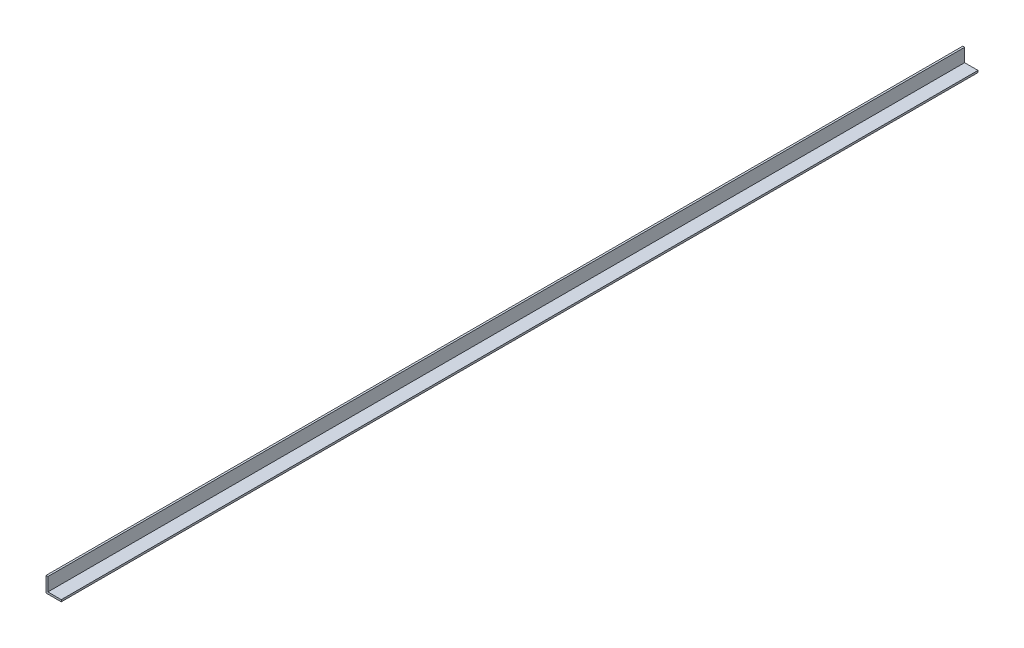
ISO-10303-21;
HEADER;
FILE_DESCRIPTION(('STEP AP214'),'2;1');
FILE_NAME('part.step','',(''),(''),'','','');
FILE_SCHEMA(('AUTOMOTIVE_DESIGN { 1 0 10303 214 1 1 1 1 }'));
ENDSEC;
DATA;
#1=APPLICATION_CONTEXT('core data for automotive mechanical design processes');
#2=APPLICATION_PROTOCOL_DEFINITION('international standard','automotive_design',2000,#1);
#3=PRODUCT_CONTEXT('',#1,'mechanical');
#4=PRODUCT('Part','Part','',(#3));
#5=PRODUCT_RELATED_PRODUCT_CATEGORY('part','',(#4));
#6=PRODUCT_DEFINITION_FORMATION('','',#4);
#7=PRODUCT_DEFINITION_CONTEXT('part definition',#1,'design');
#8=PRODUCT_DEFINITION('design','',#6,#7);
#9=PRODUCT_DEFINITION_SHAPE('','',#8);
#10=(LENGTH_UNIT() NAMED_UNIT(*) SI_UNIT(.MILLI.,.METRE.));
#11=(NAMED_UNIT(*) PLANE_ANGLE_UNIT() SI_UNIT($,.RADIAN.));
#12=(NAMED_UNIT(*) SI_UNIT($,.STERADIAN.) SOLID_ANGLE_UNIT());
#13=UNCERTAINTY_MEASURE_WITH_UNIT(LENGTH_MEASURE(1.E-05),#10,'distance_accuracy_value','');
#14=(GEOMETRIC_REPRESENTATION_CONTEXT(3) GLOBAL_UNCERTAINTY_ASSIGNED_CONTEXT((#13)) GLOBAL_UNIT_ASSIGNED_CONTEXT((#10,
#11,#12)) REPRESENTATION_CONTEXT('',''));
#15=CARTESIAN_POINT('',(0.,0.,0.));
#16=DIRECTION('',(0.,0.,1.));
#17=DIRECTION('',(1.,0.,0.));
#18=AXIS2_PLACEMENT_3D('',#15,#16,#17);
#19=CARTESIAN_POINT('',(12.7,101.6,-6100.));
#20=DIRECTION('',(0.,1.,0.));
#21=DIRECTION('',(0.,0.,1.));
#22=AXIS2_PLACEMENT_3D('',#19,#20,#21);
#23=PLANE('',#22);
#24=DIRECTION('',(-1.,0.,0.));
#25=VECTOR('',#24,1.);
#26=CARTESIAN_POINT('',(12.7,101.6,0.));
#27=LINE('',#26,#25);
#28=CARTESIAN_POINT('',(12.7,101.6,0.));
#29=VERTEX_POINT('',#28);
#30=CARTESIAN_POINT('',(0.,101.6,0.));
#31=VERTEX_POINT('',#30);
#32=EDGE_CURVE('E118',#29,#31,#27,.T.);
#33=ORIENTED_EDGE('',*,*,#32,.F.);
#34=DIRECTION('',(0.,0.,1.));
#35=VECTOR('',#34,1.);
#36=CARTESIAN_POINT('',(12.7,101.6,-6100.));
#37=LINE('',#36,#35);
#38=CARTESIAN_POINT('',(12.7,101.6,-6100.));
#39=VERTEX_POINT('',#38);
#40=EDGE_CURVE('E11',#39,#29,#37,.T.);
#41=ORIENTED_EDGE('',*,*,#40,.F.);
#42=DIRECTION('',(-1.,0.,0.));
#43=VECTOR('',#42,1.);
#44=CARTESIAN_POINT('',(12.7,101.6,-6100.));
#45=LINE('',#44,#43);
#46=CARTESIAN_POINT('',(0.,101.6,-6100.));
#47=VERTEX_POINT('',#46);
#48=EDGE_CURVE('E132',#39,#47,#45,.T.);
#49=ORIENTED_EDGE('',*,*,#48,.T.);
#50=DIRECTION('',(0.,0.,1.));
#51=VECTOR('',#50,1.);
#52=CARTESIAN_POINT('',(0.,101.6,-6100.));
#53=LINE('',#52,#51);
#54=EDGE_CURVE('E36',#47,#31,#53,.T.);
#55=ORIENTED_EDGE('',*,*,#54,.T.);
#56=EDGE_LOOP('',(#33,#41,#49,#55));
#57=FACE_BOUND('',#56,.T.);
#58=ADVANCED_FACE('F33',(#57),#23,.T.);
#59=CARTESIAN_POINT('',(12.7,12.7,-6100.));
#60=DIRECTION('',(1.,0.,0.));
#61=DIRECTION('',(0.,1.,0.));
#62=AXIS2_PLACEMENT_3D('',#59,#60,#61);
#63=PLANE('',#62);
#64=DIRECTION('',(0.,1.,0.));
#65=VECTOR('',#64,1.);
#66=CARTESIAN_POINT('',(12.7,12.7,0.));
#67=LINE('',#66,#65);
#68=CARTESIAN_POINT('',(12.7,12.7,0.));
#69=VERTEX_POINT('',#68);
#70=EDGE_CURVE('E130',#69,#29,#67,.T.);
#71=ORIENTED_EDGE('',*,*,#70,.F.);
#72=DIRECTION('',(0.,0.,1.));
#73=VECTOR('',#72,1.);
#74=CARTESIAN_POINT('',(12.7,12.7,-6100.));
#75=LINE('',#74,#73);
#76=CARTESIAN_POINT('',(12.7,12.7,-6100.));
#77=VERTEX_POINT('',#76);
#78=EDGE_CURVE('E42',#77,#69,#75,.T.);
#79=ORIENTED_EDGE('',*,*,#78,.F.);
#80=DIRECTION('',(0.,1.,0.));
#81=VECTOR('',#80,1.);
#82=CARTESIAN_POINT('',(12.7,12.7,-6100.));
#83=LINE('',#82,#81);
#84=EDGE_CURVE('E108',#77,#39,#83,.T.);
#85=ORIENTED_EDGE('',*,*,#84,.T.);
#86=ORIENTED_EDGE('',*,*,#40,.T.);
#87=EDGE_LOOP('',(#71,#79,#85,#86));
#88=FACE_BOUND('',#87,.T.);
#89=ADVANCED_FACE('F140',(#88),#63,.T.);
#90=CARTESIAN_POINT('',(101.6,12.7,-6100.));
#91=DIRECTION('',(0.,1.,0.));
#92=DIRECTION('',(-1.,0.,0.));
#93=AXIS2_PLACEMENT_3D('',#90,#91,#92);
#94=PLANE('',#93);
#95=DIRECTION('',(-1.,0.,0.));
#96=VECTOR('',#95,1.);
#97=CARTESIAN_POINT('',(101.6,12.7,0.));
#98=LINE('',#97,#96);
#99=CARTESIAN_POINT('',(101.6,12.7,0.));
#100=VERTEX_POINT('',#99);
#101=EDGE_CURVE('E95',#100,#69,#98,.T.);
#102=ORIENTED_EDGE('',*,*,#101,.F.);
#103=DIRECTION('',(0.,0.,1.));
#104=VECTOR('',#103,1.);
#105=CARTESIAN_POINT('',(101.6,12.7,-6100.));
#106=LINE('',#105,#104);
#107=CARTESIAN_POINT('',(101.6,12.7,-6100.));
#108=VERTEX_POINT('',#107);
#109=EDGE_CURVE('E90',#108,#100,#106,.T.);
#110=ORIENTED_EDGE('',*,*,#109,.F.);
#111=DIRECTION('',(-1.,0.,0.));
#112=VECTOR('',#111,1.);
#113=CARTESIAN_POINT('',(101.6,12.7,-6100.));
#114=LINE('',#113,#112);
#115=EDGE_CURVE('E93',#108,#77,#114,.T.);
#116=ORIENTED_EDGE('',*,*,#115,.T.);
#117=ORIENTED_EDGE('',*,*,#78,.T.);
#118=EDGE_LOOP('',(#102,#110,#116,#117));
#119=FACE_BOUND('',#118,.T.);
#120=ADVANCED_FACE('F92',(#119),#94,.T.);
#121=CARTESIAN_POINT('',(101.6,0.,-6100.));
#122=DIRECTION('',(1.,0.,0.));
#123=DIRECTION('',(0.,0.,-1.));
#124=AXIS2_PLACEMENT_3D('',#121,#122,#123);
#125=PLANE('',#124);
#126=DIRECTION('',(0.,1.,0.));
#127=VECTOR('',#126,1.);
#128=CARTESIAN_POINT('',(101.6,0.,0.));
#129=LINE('',#128,#127);
#130=CARTESIAN_POINT('',(101.6,0.,0.));
#131=VERTEX_POINT('',#130);
#132=EDGE_CURVE('E127',#131,#100,#129,.T.);
#133=ORIENTED_EDGE('',*,*,#132,.F.);
#134=DIRECTION('',(0.,0.,1.));
#135=VECTOR('',#134,1.);
#136=CARTESIAN_POINT('',(101.6,0.,-6100.));
#137=LINE('',#136,#135);
#138=CARTESIAN_POINT('',(101.6,0.,-6100.));
#139=VERTEX_POINT('',#138);
#140=EDGE_CURVE('E100',#139,#131,#137,.T.);
#141=ORIENTED_EDGE('',*,*,#140,.F.);
#142=DIRECTION('',(0.,1.,0.));
#143=VECTOR('',#142,1.);
#144=CARTESIAN_POINT('',(101.6,0.,-6100.));
#145=LINE('',#144,#143);
#146=EDGE_CURVE('E106',#139,#108,#145,.T.);
#147=ORIENTED_EDGE('',*,*,#146,.T.);
#148=ORIENTED_EDGE('',*,*,#109,.T.);
#149=EDGE_LOOP('',(#133,#141,#147,#148));
#150=FACE_BOUND('',#149,.T.);
#151=ADVANCED_FACE('F110',(#150),#125,.T.);
#152=CARTESIAN_POINT('',(0.,0.,-6100.));
#153=DIRECTION('',(0.,-1.,0.));
#154=DIRECTION('',(0.,0.,-1.));
#155=AXIS2_PLACEMENT_3D('',#152,#153,#154);
#156=PLANE('',#155);
#157=DIRECTION('',(1.,0.,0.));
#158=VECTOR('',#157,1.);
#159=CARTESIAN_POINT('',(0.,0.,0.));
#160=LINE('',#159,#158);
#161=CARTESIAN_POINT('',(0.,0.,0.));
#162=VERTEX_POINT('',#161);
#163=EDGE_CURVE('E124',#162,#131,#160,.T.);
#164=ORIENTED_EDGE('',*,*,#163,.F.);
#165=DIRECTION('',(0.,0.,1.));
#166=VECTOR('',#165,1.);
#167=CARTESIAN_POINT('',(0.,0.,-6100.));
#168=LINE('',#167,#166);
#169=CARTESIAN_POINT('',(0.,0.,-6100.));
#170=VERTEX_POINT('',#169);
#171=EDGE_CURVE('E135',#170,#162,#168,.T.);
#172=ORIENTED_EDGE('',*,*,#171,.F.);
#173=DIRECTION('',(1.,0.,0.));
#174=VECTOR('',#173,1.);
#175=CARTESIAN_POINT('',(0.,0.,-6100.));
#176=LINE('',#175,#174);
#177=EDGE_CURVE('E111',#170,#139,#176,.T.);
#178=ORIENTED_EDGE('',*,*,#177,.T.);
#179=ORIENTED_EDGE('',*,*,#140,.T.);
#180=EDGE_LOOP('',(#164,#172,#178,#179));
#181=FACE_BOUND('',#180,.T.);
#182=ADVANCED_FACE('F153',(#181),#156,.T.);
#183=CARTESIAN_POINT('',(0.,101.6,-6100.));
#184=DIRECTION('',(-1.,0.,0.));
#185=DIRECTION('',(0.,-1.,0.));
#186=AXIS2_PLACEMENT_3D('',#183,#184,#185);
#187=PLANE('',#186);
#188=DIRECTION('',(0.,-1.,0.));
#189=VECTOR('',#188,1.);
#190=CARTESIAN_POINT('',(0.,101.6,0.));
#191=LINE('',#190,#189);
#192=EDGE_CURVE('E121',#31,#162,#191,.T.);
#193=ORIENTED_EDGE('',*,*,#192,.F.);
#194=ORIENTED_EDGE('',*,*,#54,.F.);
#195=DIRECTION('',(0.,-1.,0.));
#196=VECTOR('',#195,1.);
#197=CARTESIAN_POINT('',(0.,101.6,-6100.));
#198=LINE('',#197,#196);
#199=EDGE_CURVE('E113',#47,#170,#198,.T.);
#200=ORIENTED_EDGE('',*,*,#199,.T.);
#201=ORIENTED_EDGE('',*,*,#171,.T.);
#202=EDGE_LOOP('',(#193,#194,#200,#201));
#203=FACE_BOUND('',#202,.T.);
#204=ADVANCED_FACE('F137',(#203),#187,.T.);
#205=CARTESIAN_POINT('',(0.,0.,-6100.));
#206=DIRECTION('',(0.,0.,1.));
#207=DIRECTION('',(1.,0.,0.));
#208=AXIS2_PLACEMENT_3D('',#205,#206,#207);
#209=PLANE('',#208);
#210=ORIENTED_EDGE('',*,*,#48,.F.);
#211=ORIENTED_EDGE('',*,*,#84,.F.);
#212=ORIENTED_EDGE('',*,*,#115,.F.);
#213=ORIENTED_EDGE('',*,*,#146,.F.);
#214=ORIENTED_EDGE('',*,*,#177,.F.);
#215=ORIENTED_EDGE('',*,*,#199,.F.);
#216=EDGE_LOOP('',(#210,#211,#212,#213,#214,#215));
#217=FACE_BOUND('',#216,.T.);
#218=ADVANCED_FACE('F104',(#217),#209,.F.);
#219=CARTESIAN_POINT('',(0.,0.,0.));
#220=DIRECTION('',(0.,0.,1.));
#221=DIRECTION('',(1.,0.,0.));
#222=AXIS2_PLACEMENT_3D('',#219,#220,#221);
#223=PLANE('',#222);
#224=ORIENTED_EDGE('',*,*,#32,.T.);
#225=ORIENTED_EDGE('',*,*,#192,.T.);
#226=ORIENTED_EDGE('',*,*,#163,.T.);
#227=ORIENTED_EDGE('',*,*,#132,.T.);
#228=ORIENTED_EDGE('',*,*,#101,.T.);
#229=ORIENTED_EDGE('',*,*,#70,.T.);
#230=EDGE_LOOP('',(#224,#225,#226,#227,#228,#229));
#231=FACE_BOUND('',#230,.T.);
#232=ADVANCED_FACE('F139',(#231),#223,.T.);
#233=CLOSED_SHELL('',(#58,#89,#120,#151,#182,#204,#218,#232));
#234=MANIFOLD_SOLID_BREP('B2',#233);
#235=ADVANCED_BREP_SHAPE_REPRESENTATION('',(#18,#234),#14);
#236=SHAPE_DEFINITION_REPRESENTATION(#9,#235);
ENDSEC;
END-ISO-10303-21;
